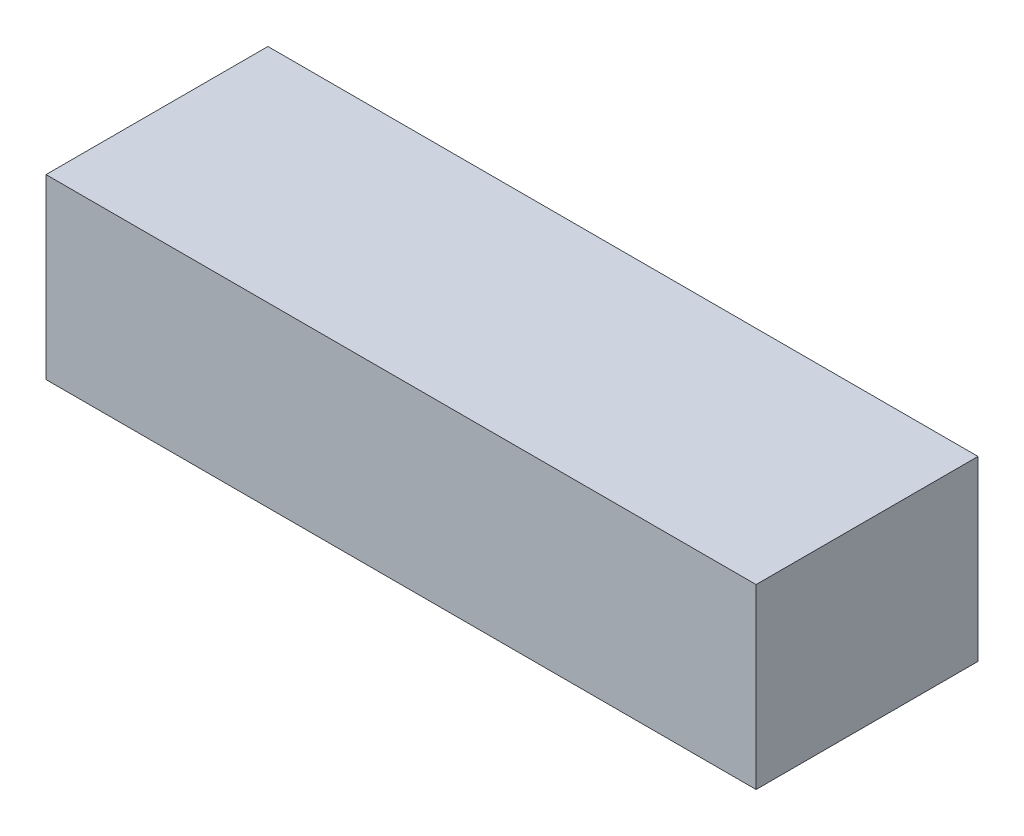
ISO-10303-21;
HEADER;
FILE_DESCRIPTION(('STEP AP214'),'2;1');
FILE_NAME('part.step','',(''),(''),'','','');
FILE_SCHEMA(('AUTOMOTIVE_DESIGN { 1 0 10303 214 1 1 1 1 }'));
ENDSEC;
DATA;
#1=APPLICATION_CONTEXT('core data for automotive mechanical design processes');
#2=APPLICATION_PROTOCOL_DEFINITION('international standard','automotive_design',2000,#1);
#3=PRODUCT_CONTEXT('',#1,'mechanical');
#4=PRODUCT('Part','Part','',(#3));
#5=PRODUCT_RELATED_PRODUCT_CATEGORY('part','',(#4));
#6=PRODUCT_DEFINITION_FORMATION('','',#4);
#7=PRODUCT_DEFINITION_CONTEXT('part definition',#1,'design');
#8=PRODUCT_DEFINITION('design','',#6,#7);
#9=PRODUCT_DEFINITION_SHAPE('','',#8);
#10=(LENGTH_UNIT() NAMED_UNIT(*) SI_UNIT(.MILLI.,.METRE.));
#11=(NAMED_UNIT(*) PLANE_ANGLE_UNIT() SI_UNIT($,.RADIAN.));
#12=(NAMED_UNIT(*) SI_UNIT($,.STERADIAN.) SOLID_ANGLE_UNIT());
#13=UNCERTAINTY_MEASURE_WITH_UNIT(LENGTH_MEASURE(1.E-05),#10,'distance_accuracy_value','');
#14=(GEOMETRIC_REPRESENTATION_CONTEXT(3) GLOBAL_UNCERTAINTY_ASSIGNED_CONTEXT((#13)) GLOBAL_UNIT_ASSIGNED_CONTEXT((#10,
#11,#12)) REPRESENTATION_CONTEXT('',''));
#15=CARTESIAN_POINT('',(0.,0.,0.));
#16=DIRECTION('',(0.,0.,1.));
#17=DIRECTION('',(1.,0.,0.));
#18=AXIS2_PLACEMENT_3D('',#15,#16,#17);
#19=CARTESIAN_POINT('',(40.64,10.1599999999999,0.));
#20=DIRECTION('',(0.,0.,-0.999999999999999));
#21=DIRECTION('',(-1.,0.,0.));
#22=AXIS2_PLACEMENT_3D('',#19,#20,#21);
#23=PLANE('',#22);
#24=DIRECTION('',(1.,0.,0.));
#25=VECTOR('',#24,1.);
#26=CARTESIAN_POINT('',(40.64,0.,0.));
#27=LINE('',#26,#25);
#28=CARTESIAN_POINT('',(0.,0.,0.));
#29=VERTEX_POINT('',#28);
#30=CARTESIAN_POINT('',(40.64,0.,0.));
#31=VERTEX_POINT('',#30);
#32=EDGE_CURVE('E91',#29,#31,#27,.T.);
#33=ORIENTED_EDGE('',*,*,#32,.T.);
#34=DIRECTION('',(0.,-0.999999999999999,0.));
#35=VECTOR('',#34,1.);
#36=CARTESIAN_POINT('',(40.64,10.1599999999999,0.));
#37=LINE('',#36,#35);
#38=CARTESIAN_POINT('',(40.64,10.1599999999999,0.));
#39=VERTEX_POINT('',#38);
#40=EDGE_CURVE('E11',#39,#31,#37,.T.);
#41=ORIENTED_EDGE('',*,*,#40,.F.);
#42=DIRECTION('',(1.,0.,0.));
#43=VECTOR('',#42,1.);
#44=CARTESIAN_POINT('',(40.64,10.1599999999999,0.));
#45=LINE('',#44,#43);
#46=CARTESIAN_POINT('',(0.,10.1599999999999,0.));
#47=VERTEX_POINT('',#46);
#48=EDGE_CURVE('E79',#47,#39,#45,.T.);
#49=ORIENTED_EDGE('',*,*,#48,.F.);
#50=DIRECTION('',(0.,-0.999999999999999,0.));
#51=VECTOR('',#50,1.);
#52=CARTESIAN_POINT('',(0.,10.1599999999999,0.));
#53=LINE('',#52,#51);
#54=EDGE_CURVE('E87',#47,#29,#53,.T.);
#55=ORIENTED_EDGE('',*,*,#54,.T.);
#56=EDGE_LOOP('',(#33,#41,#49,#55));
#57=FACE_BOUND('',#56,.T.);
#58=ADVANCED_FACE('F28',(#57),#23,.F.);
#59=CARTESIAN_POINT('',(40.64,10.1599999999999,-12.6999999999999));
#60=DIRECTION('',(-1.,0.,0.));
#61=DIRECTION('',(0.,0.,0.999999999999999));
#62=AXIS2_PLACEMENT_3D('',#59,#60,#61);
#63=PLANE('',#62);
#64=DIRECTION('',(0.,0.,-0.999999999999999));
#65=VECTOR('',#64,1.);
#66=CARTESIAN_POINT('',(40.64,0.,-12.7));
#67=LINE('',#66,#65);
#68=CARTESIAN_POINT('',(40.64,0.,-12.7));
#69=VERTEX_POINT('',#68);
#70=EDGE_CURVE('E83',#31,#69,#67,.T.);
#71=ORIENTED_EDGE('',*,*,#70,.T.);
#72=DIRECTION('',(0.,-0.999999999999999,0.));
#73=VECTOR('',#72,1.);
#74=CARTESIAN_POINT('',(40.64,10.1599999999999,-12.6999999999999));
#75=LINE('',#74,#73);
#76=CARTESIAN_POINT('',(40.64,10.1599999999999,-12.6999999999999));
#77=VERTEX_POINT('',#76);
#78=EDGE_CURVE('E36',#77,#69,#75,.T.);
#79=ORIENTED_EDGE('',*,*,#78,.F.);
#80=DIRECTION('',(0.,0.,-0.999999999999999));
#81=VECTOR('',#80,1.);
#82=CARTESIAN_POINT('',(40.64,10.1599999999999,-12.6999999999999));
#83=LINE('',#82,#81);
#84=EDGE_CURVE('E74',#39,#77,#83,.T.);
#85=ORIENTED_EDGE('',*,*,#84,.F.);
#86=ORIENTED_EDGE('',*,*,#40,.T.);
#87=EDGE_LOOP('',(#71,#79,#85,#86));
#88=FACE_BOUND('',#87,.T.);
#89=ADVANCED_FACE('F82',(#88),#63,.F.);
#90=CARTESIAN_POINT('',(0.,10.1599999999999,-12.6999999999999));
#91=DIRECTION('',(0.,0.,0.999999999999999));
#92=DIRECTION('',(1.,0.,0.));
#93=AXIS2_PLACEMENT_3D('',#90,#91,#92);
#94=PLANE('',#93);
#95=DIRECTION('',(-1.,0.,0.));
#96=VECTOR('',#95,1.);
#97=CARTESIAN_POINT('',(0.,0.,-12.7));
#98=LINE('',#97,#96);
#99=CARTESIAN_POINT('',(0.,0.,-12.7));
#100=VERTEX_POINT('',#99);
#101=EDGE_CURVE('E61',#69,#100,#98,.T.);
#102=ORIENTED_EDGE('',*,*,#101,.T.);
#103=DIRECTION('',(0.,-0.999999999999999,0.));
#104=VECTOR('',#103,1.);
#105=CARTESIAN_POINT('',(0.,10.1599999999999,-12.6999999999999));
#106=LINE('',#105,#104);
#107=CARTESIAN_POINT('',(0.,10.1599999999999,-12.6999999999999));
#108=VERTEX_POINT('',#107);
#109=EDGE_CURVE('E84',#108,#100,#106,.T.);
#110=ORIENTED_EDGE('',*,*,#109,.F.);
#111=DIRECTION('',(-1.,0.,0.));
#112=VECTOR('',#111,1.);
#113=CARTESIAN_POINT('',(0.,10.1599999999999,-12.6999999999999));
#114=LINE('',#113,#112);
#115=EDGE_CURVE('E77',#77,#108,#114,.T.);
#116=ORIENTED_EDGE('',*,*,#115,.F.);
#117=ORIENTED_EDGE('',*,*,#78,.T.);
#118=EDGE_LOOP('',(#102,#110,#116,#117));
#119=FACE_BOUND('',#118,.T.);
#120=ADVANCED_FACE('F85',(#119),#94,.F.);
#121=CARTESIAN_POINT('',(0.,10.1599999999999,0.));
#122=DIRECTION('',(1.,0.,0.));
#123=DIRECTION('',(0.,0.,-0.999999999999999));
#124=AXIS2_PLACEMENT_3D('',#121,#122,#123);
#125=PLANE('',#124);
#126=DIRECTION('',(0.,0.,0.999999999999999));
#127=VECTOR('',#126,1.);
#128=CARTESIAN_POINT('',(0.,0.,0.));
#129=LINE('',#128,#127);
#130=EDGE_CURVE('E67',#100,#29,#129,.T.);
#131=ORIENTED_EDGE('',*,*,#130,.T.);
#132=ORIENTED_EDGE('',*,*,#54,.F.);
#133=DIRECTION('',(0.,0.,0.999999999999999));
#134=VECTOR('',#133,1.);
#135=CARTESIAN_POINT('',(0.,10.1599999999999,0.));
#136=LINE('',#135,#134);
#137=EDGE_CURVE('E44',#108,#47,#136,.T.);
#138=ORIENTED_EDGE('',*,*,#137,.F.);
#139=ORIENTED_EDGE('',*,*,#109,.T.);
#140=EDGE_LOOP('',(#131,#132,#138,#139));
#141=FACE_BOUND('',#140,.T.);
#142=ADVANCED_FACE('F98',(#141),#125,.F.);
#143=CARTESIAN_POINT('',(0.,10.1599999999999,0.));
#144=DIRECTION('',(0.,-0.999999999999999,0.));
#145=DIRECTION('',(0.,0.,-0.999999999999999));
#146=AXIS2_PLACEMENT_3D('',#143,#144,#145);
#147=PLANE('',#146);
#148=ORIENTED_EDGE('',*,*,#48,.T.);
#149=ORIENTED_EDGE('',*,*,#84,.T.);
#150=ORIENTED_EDGE('',*,*,#115,.T.);
#151=ORIENTED_EDGE('',*,*,#137,.T.);
#152=EDGE_LOOP('',(#148,#149,#150,#151));
#153=FACE_BOUND('',#152,.T.);
#154=ADVANCED_FACE('F75',(#153),#147,.F.);
#155=CARTESIAN_POINT('',(0.,0.,0.));
#156=DIRECTION('',(0.,-0.999999999999999,0.));
#157=DIRECTION('',(0.,0.,-0.999999999999999));
#158=AXIS2_PLACEMENT_3D('',#155,#156,#157);
#159=PLANE('',#158);
#160=ORIENTED_EDGE('',*,*,#32,.F.);
#161=ORIENTED_EDGE('',*,*,#130,.F.);
#162=ORIENTED_EDGE('',*,*,#101,.F.);
#163=ORIENTED_EDGE('',*,*,#70,.F.);
#164=EDGE_LOOP('',(#160,#161,#162,#163));
#165=FACE_BOUND('',#164,.T.);
#166=ADVANCED_FACE('F101',(#165),#159,.T.);
#167=CLOSED_SHELL('',(#58,#89,#120,#142,#154,#166));
#168=MANIFOLD_SOLID_BREP('B2',#167);
#169=ADVANCED_BREP_SHAPE_REPRESENTATION('',(#18,#168),#14);
#170=SHAPE_DEFINITION_REPRESENTATION(#9,#169);
ENDSEC;
END-ISO-10303-21;
